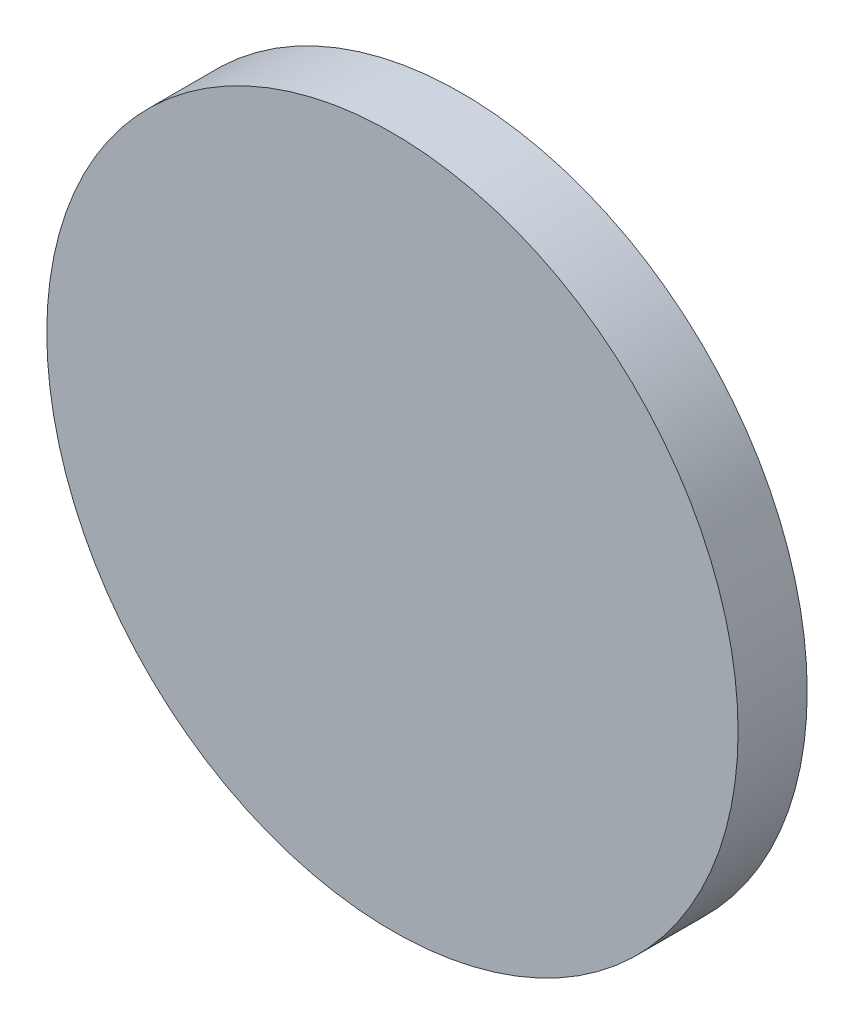
ISO-10303-21;
HEADER;
FILE_DESCRIPTION(('STEP AP214'),'2;1');
FILE_NAME('part.step','',(''),(''),'','','');
FILE_SCHEMA(('AUTOMOTIVE_DESIGN { 1 0 10303 214 1 1 1 1 }'));
ENDSEC;
DATA;
#1=APPLICATION_CONTEXT('core data for automotive mechanical design processes');
#2=APPLICATION_PROTOCOL_DEFINITION('international standard','automotive_design',2000,#1);
#3=PRODUCT_CONTEXT('',#1,'mechanical');
#4=PRODUCT('Part','Part','',(#3));
#5=PRODUCT_RELATED_PRODUCT_CATEGORY('part','',(#4));
#6=PRODUCT_DEFINITION_FORMATION('','',#4);
#7=PRODUCT_DEFINITION_CONTEXT('part definition',#1,'design');
#8=PRODUCT_DEFINITION('design','',#6,#7);
#9=PRODUCT_DEFINITION_SHAPE('','',#8);
#10=(LENGTH_UNIT() NAMED_UNIT(*) SI_UNIT(.MILLI.,.METRE.));
#11=(NAMED_UNIT(*) PLANE_ANGLE_UNIT() SI_UNIT($,.RADIAN.));
#12=(NAMED_UNIT(*) SI_UNIT($,.STERADIAN.) SOLID_ANGLE_UNIT());
#13=UNCERTAINTY_MEASURE_WITH_UNIT(LENGTH_MEASURE(1.E-05),#10,'distance_accuracy_value','');
#14=(GEOMETRIC_REPRESENTATION_CONTEXT(3) GLOBAL_UNCERTAINTY_ASSIGNED_CONTEXT((#13)) GLOBAL_UNIT_ASSIGNED_CONTEXT((#10,
#11,#12)) REPRESENTATION_CONTEXT('',''));
#15=CARTESIAN_POINT('',(0.,0.,0.));
#16=DIRECTION('',(0.,0.,1.));
#17=DIRECTION('',(1.,0.,0.));
#18=AXIS2_PLACEMENT_3D('',#15,#16,#17);
#19=CARTESIAN_POINT('',(0.,0.,100.));
#20=DIRECTION('',(0.,0.,-1.));
#21=DIRECTION('',(-1.,0.,0.));
#22=AXIS2_PLACEMENT_3D('',#19,#20,#21);
#23=CYLINDRICAL_SURFACE('',#22,500.);
#24=CARTESIAN_POINT('',(0.,0.,100.));
#25=DIRECTION('',(0.,0.,1.));
#26=DIRECTION('',(1.,0.,0.));
#27=AXIS2_PLACEMENT_3D('',#24,#25,#26);
#28=CIRCLE('',#27,500.);
#29=CARTESIAN_POINT('',(500.,0.,100.));
#30=VERTEX_POINT('',#29);
#31=EDGE_CURVE('E10',#30,#30,#28,.T.);
#32=ORIENTED_EDGE('',*,*,#31,.F.);
#33=EDGE_LOOP('',(#32));
#34=FACE_BOUND('',#33,.T.);
#35=CARTESIAN_POINT('',(0.,0.,0.));
#36=DIRECTION('',(0.,0.,1.));
#37=DIRECTION('',(1.,0.,0.));
#38=AXIS2_PLACEMENT_3D('',#35,#36,#37);
#39=CIRCLE('',#38,500.);
#40=CARTESIAN_POINT('',(500.,0.,0.));
#41=VERTEX_POINT('',#40);
#42=EDGE_CURVE('E44',#41,#41,#39,.T.);
#43=ORIENTED_EDGE('',*,*,#42,.T.);
#44=EDGE_LOOP('',(#43));
#45=FACE_BOUND('',#44,.T.);
#46=ADVANCED_FACE('F41',(#34,#45),#23,.T.);
#47=CARTESIAN_POINT('',(0.,0.,100.));
#48=DIRECTION('',(0.,0.,1.));
#49=DIRECTION('',(1.,0.,0.));
#50=AXIS2_PLACEMENT_3D('',#47,#48,#49);
#51=PLANE('',#50);
#52=ORIENTED_EDGE('',*,*,#31,.T.);
#53=EDGE_LOOP('',(#52));
#54=FACE_BOUND('',#53,.T.);
#55=ADVANCED_FACE('F58',(#54),#51,.T.);
#56=CARTESIAN_POINT('',(0.,0.,0.));
#57=DIRECTION('',(0.,0.,1.));
#58=DIRECTION('',(1.,0.,0.));
#59=AXIS2_PLACEMENT_3D('',#56,#57,#58);
#60=PLANE('',#59);
#61=ORIENTED_EDGE('',*,*,#42,.F.);
#62=EDGE_LOOP('',(#61));
#63=FACE_BOUND('',#62,.T.);
#64=ADVANCED_FACE('F56',(#63),#60,.F.);
#65=CLOSED_SHELL('',(#46,#55,#64));
#66=MANIFOLD_SOLID_BREP('B2',#65);
#67=ADVANCED_BREP_SHAPE_REPRESENTATION('',(#18,#66),#14);
#68=SHAPE_DEFINITION_REPRESENTATION(#9,#67);
ENDSEC;
END-ISO-10303-21;
